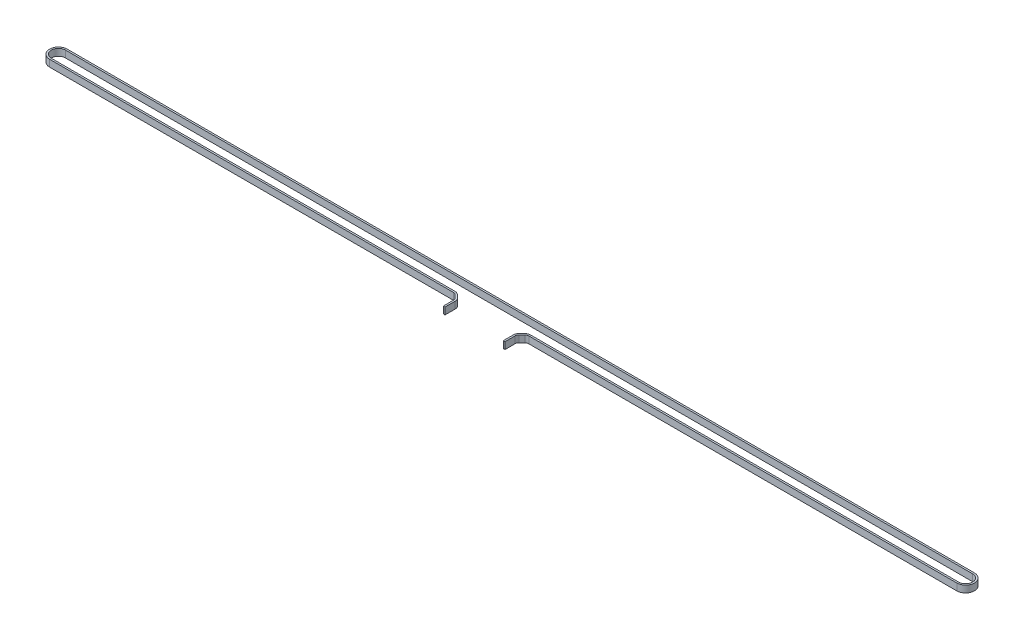
ISO-10303-21;
HEADER;
FILE_DESCRIPTION(('STEP AP214'),'2;1');
FILE_NAME('part.step','',(''),(''),'','','');
FILE_SCHEMA(('AUTOMOTIVE_DESIGN { 1 0 10303 214 1 1 1 1 }'));
ENDSEC;
DATA;
#1=APPLICATION_CONTEXT('core data for automotive mechanical design processes');
#2=APPLICATION_PROTOCOL_DEFINITION('international standard','automotive_design',2000,#1);
#3=PRODUCT_CONTEXT('',#1,'mechanical');
#4=PRODUCT('Part','Part','',(#3));
#5=PRODUCT_RELATED_PRODUCT_CATEGORY('part','',(#4));
#6=PRODUCT_DEFINITION_FORMATION('','',#4);
#7=PRODUCT_DEFINITION_CONTEXT('part definition',#1,'design');
#8=PRODUCT_DEFINITION('design','',#6,#7);
#9=PRODUCT_DEFINITION_SHAPE('','',#8);
#10=(LENGTH_UNIT() NAMED_UNIT(*) SI_UNIT(.MILLI.,.METRE.));
#11=(NAMED_UNIT(*) PLANE_ANGLE_UNIT() SI_UNIT($,.RADIAN.));
#12=(NAMED_UNIT(*) SI_UNIT($,.STERADIAN.) SOLID_ANGLE_UNIT());
#13=UNCERTAINTY_MEASURE_WITH_UNIT(LENGTH_MEASURE(1.E-05),#10,'distance_accuracy_value','');
#14=(GEOMETRIC_REPRESENTATION_CONTEXT(3) GLOBAL_UNCERTAINTY_ASSIGNED_CONTEXT((#13)) GLOBAL_UNIT_ASSIGNED_CONTEXT((#10,
#11,#12)) REPRESENTATION_CONTEXT('',''));
#15=CARTESIAN_POINT('',(0.,0.,0.));
#16=DIRECTION('',(0.,0.,1.));
#17=DIRECTION('',(1.,0.,0.));
#18=AXIS2_PLACEMENT_3D('',#15,#16,#17);
#19=CARTESIAN_POINT('',(397.,3.,6.19999999999985));
#20=DIRECTION('',(0.,0.,-1.));
#21=DIRECTION('',(-1.,0.,0.));
#22=AXIS2_PLACEMENT_3D('',#19,#20,#21);
#23=PLANE('',#22);
#24=DIRECTION('',(1.,0.,0.));
#25=VECTOR('',#24,1.);
#26=CARTESIAN_POINT('',(397.,3.,6.19999999999985));
#27=LINE('',#26,#25);
#28=CARTESIAN_POINT('',(-397.,3.,6.19999999999985));
#29=VERTEX_POINT('',#28);
#30=CARTESIAN_POINT('',(-43.6628270340245,3.,6.19999999999985));
#31=VERTEX_POINT('',#30);
#32=EDGE_CURVE('E293',#29,#31,#27,.T.);
#33=ORIENTED_EDGE('',*,*,#32,.T.);
#34=DIRECTION('',(0.,1.,0.));
#35=VECTOR('',#34,1.);
#36=CARTESIAN_POINT('',(-43.6628270340245,-3.,6.19999999999985));
#37=LINE('',#36,#35);
#38=CARTESIAN_POINT('',(-43.6628270340245,-3.,6.19999999999985));
#39=VERTEX_POINT('',#38);
#40=EDGE_CURVE('E381',#31,#39,#37,.F.);
#41=ORIENTED_EDGE('',*,*,#40,.T.);
#42=DIRECTION('',(1.,0.,0.));
#43=VECTOR('',#42,1.);
#44=CARTESIAN_POINT('',(397.,-3.,6.19999999999985));
#45=LINE('',#44,#43);
#46=CARTESIAN_POINT('',(-397.,-3.,6.19999999999985));
#47=VERTEX_POINT('',#46);
#48=EDGE_CURVE('E287',#47,#39,#45,.T.);
#49=ORIENTED_EDGE('',*,*,#48,.F.);
#50=DIRECTION('',(0.,-1.,0.));
#51=VECTOR('',#50,1.);
#52=CARTESIAN_POINT('',(-397.,3.,6.19999999999985));
#53=LINE('',#52,#51);
#54=EDGE_CURVE('E310',#29,#47,#53,.T.);
#55=ORIENTED_EDGE('',*,*,#54,.F.);
#56=EDGE_LOOP('',(#33,#41,#49,#55));
#57=FACE_BOUND('',#56,.T.);
#58=ADVANCED_FACE('F33',(#57),#23,.T.);
#59=CARTESIAN_POINT('',(397.,3.,7.69999999999985));
#60=DIRECTION('',(0.,0.,-1.));
#61=DIRECTION('',(-1.,0.,0.));
#62=AXIS2_PLACEMENT_3D('',#59,#60,#61);
#63=PLANE('',#62);
#64=DIRECTION('',(1.,0.,0.));
#65=VECTOR('',#64,1.);
#66=CARTESIAN_POINT('',(397.,3.,7.69999999999985));
#67=LINE('',#66,#65);
#68=CARTESIAN_POINT('',(22.3712533085623,3.,7.69999999999997));
#69=VERTEX_POINT('',#68);
#70=CARTESIAN_POINT('',(397.,3.,7.69999999999985));
#71=VERTEX_POINT('',#70);
#72=EDGE_CURVE('E326',#69,#71,#67,.T.);
#73=ORIENTED_EDGE('',*,*,#72,.F.);
#74=DIRECTION('',(0.,1.,0.));
#75=VECTOR('',#74,1.);
#76=CARTESIAN_POINT('',(22.3712533085623,-3.,7.69999999999997));
#77=LINE('',#76,#75);
#78=CARTESIAN_POINT('',(22.3712533085623,-3.,7.69999999999997));
#79=VERTEX_POINT('',#78);
#80=EDGE_CURVE('E389',#69,#79,#77,.F.);
#81=ORIENTED_EDGE('',*,*,#80,.T.);
#82=DIRECTION('',(1.,0.,0.));
#83=VECTOR('',#82,1.);
#84=CARTESIAN_POINT('',(397.,-3.,7.69999999999985));
#85=LINE('',#84,#83);
#86=CARTESIAN_POINT('',(397.,-3.,7.69999999999985));
#87=VERTEX_POINT('',#86);
#88=EDGE_CURVE('E336',#79,#87,#85,.T.);
#89=ORIENTED_EDGE('',*,*,#88,.T.);
#90=DIRECTION('',(0.,-1.,0.));
#91=VECTOR('',#90,1.);
#92=CARTESIAN_POINT('',(397.,3.,7.69999999999985));
#93=LINE('',#92,#91);
#94=EDGE_CURVE('E329',#71,#87,#93,.T.);
#95=ORIENTED_EDGE('',*,*,#94,.F.);
#96=EDGE_LOOP('',(#73,#81,#89,#95));
#97=FACE_BOUND('',#96,.T.);
#98=ADVANCED_FACE('F501',(#97),#63,.F.);
#99=CARTESIAN_POINT('',(-397.,-3.,7.7000000000001));
#100=VERTEX_POINT('',#99);
#101=CARTESIAN_POINT('',(-43.6628270340243,-3.,7.69999999999999));
#102=VERTEX_POINT('',#101);
#103=EDGE_CURVE('E322',#100,#102,#85,.T.);
#104=ORIENTED_EDGE('',*,*,#103,.T.);
#105=DIRECTION('',(0.,-1.,0.));
#106=VECTOR('',#105,1.);
#107=CARTESIAN_POINT('',(-43.6628270340243,3.,7.69999999999999));
#108=LINE('',#107,#106);
#109=CARTESIAN_POINT('',(-43.6628270340243,3.,7.69999999999999));
#110=VERTEX_POINT('',#109);
#111=EDGE_CURVE('E54',#102,#110,#108,.F.);
#112=ORIENTED_EDGE('',*,*,#111,.T.);
#113=CARTESIAN_POINT('',(-397.,3.,7.7000000000001));
#114=VERTEX_POINT('',#113);
#115=EDGE_CURVE('E327',#114,#110,#67,.T.);
#116=ORIENTED_EDGE('',*,*,#115,.F.);
#117=DIRECTION('',(0.,-1.,0.));
#118=VECTOR('',#117,1.);
#119=CARTESIAN_POINT('',(-397.,3.,7.7000000000001));
#120=LINE('',#119,#118);
#121=EDGE_CURVE('E340',#114,#100,#120,.T.);
#122=ORIENTED_EDGE('',*,*,#121,.T.);
#123=EDGE_LOOP('',(#104,#112,#116,#122));
#124=FACE_BOUND('',#123,.T.);
#125=ADVANCED_FACE('F435',(#124),#63,.F.);
#126=CARTESIAN_POINT('',(397.,3.,0.));
#127=DIRECTION('',(0.,1.,0.));
#128=DIRECTION('',(0.,0.,1.));
#129=AXIS2_PLACEMENT_3D('',#126,#127,#128);
#130=PLANE('',#129);
#131=CARTESIAN_POINT('',(22.3712533085624,3.,6.19999999999985));
#132=VERTEX_POINT('',#131);
#133=CARTESIAN_POINT('',(397.,3.,6.19999999999985));
#134=VERTEX_POINT('',#133);
#135=EDGE_CURVE('E292',#132,#134,#27,.T.);
#136=ORIENTED_EDGE('',*,*,#135,.F.);
#137=CARTESIAN_POINT('',(22.3712533085624,3.,11.1999999999999));
#138=DIRECTION('',(0.,1.,0.));
#139=DIRECTION('',(0.,0.,1.));
#140=AXIS2_PLACEMENT_3D('',#137,#138,#139);
#141=CIRCLE('',#140,5.);
#142=CARTESIAN_POINT('',(18.9017871033581,3.,7.59961054176829));
#143=VERTEX_POINT('',#142);
#144=EDGE_CURVE('E357',#132,#143,#141,.T.);
#145=ORIENTED_EDGE('',*,*,#144,.T.);
#146=DIRECTION('',(-0.720077891646316,0.,0.693893241040865));
#147=VECTOR('',#146,1.);
#148=CARTESIAN_POINT('',(14.854213137269,3.,11.4999999999989));
#149=LINE('',#148,#147);
#150=CARTESIAN_POINT('',(16.3847469320647,3.,10.0251219795597));
#151=VERTEX_POINT('',#150);
#152=EDGE_CURVE('E250',#143,#151,#149,.T.);
#153=ORIENTED_EDGE('',*,*,#152,.T.);
#154=CARTESIAN_POINT('',(19.854213137269,3.,13.6255114377912));
#155=DIRECTION('',(0.,1.,0.));
#156=DIRECTION('',(0.,0.,1.));
#157=AXIS2_PLACEMENT_3D('',#154,#155,#156);
#158=CIRCLE('',#157,5.);
#159=CARTESIAN_POINT('',(14.854213137269,3.,13.6255114377912));
#160=VERTEX_POINT('',#159);
#161=EDGE_CURVE('E226',#151,#160,#158,.T.);
#162=ORIENTED_EDGE('',*,*,#161,.T.);
#163=DIRECTION('',(0.,0.,1.));
#164=VECTOR('',#163,1.);
#165=CARTESIAN_POINT('',(14.854213137269,3.,22.4999999999989));
#166=LINE('',#165,#164);
#167=CARTESIAN_POINT('',(14.854213137269,3.,22.4999999999989));
#168=VERTEX_POINT('',#167);
#169=EDGE_CURVE('E217',#160,#168,#166,.T.);
#170=ORIENTED_EDGE('',*,*,#169,.T.);
#171=DIRECTION('',(1.,0.,0.));
#172=VECTOR('',#171,1.);
#173=CARTESIAN_POINT('',(16.354213137269,3.,22.4999999999989));
#174=LINE('',#173,#172);
#175=CARTESIAN_POINT('',(16.354213137269,3.,22.4999999999989));
#176=VERTEX_POINT('',#175);
#177=EDGE_CURVE('E222',#168,#176,#174,.T.);
#178=ORIENTED_EDGE('',*,*,#177,.T.);
#179=DIRECTION('',(0.,0.,-1.));
#180=VECTOR('',#179,1.);
#181=CARTESIAN_POINT('',(16.354213137269,3.,12.1376534313366));
#182=LINE('',#181,#180);
#183=CARTESIAN_POINT('',(16.354213137269,3.,13.6255114377912));
#184=VERTEX_POINT('',#183);
#185=EDGE_CURVE('E240',#176,#184,#182,.T.);
#186=ORIENTED_EDGE('',*,*,#185,.T.);
#187=CARTESIAN_POINT('',(19.854213137269,3.,13.6255114377912));
#188=DIRECTION('',(0.,1.,0.));
#189=DIRECTION('',(0.,0.,1.));
#190=AXIS2_PLACEMENT_3D('',#187,#188,#189);
#191=CIRCLE('',#190,3.5);
#192=CARTESIAN_POINT('',(17.4255867936259,3.,11.1052388170291));
#193=VERTEX_POINT('',#192);
#194=EDGE_CURVE('E408',#184,#193,#191,.F.);
#195=ORIENTED_EDGE('',*,*,#194,.T.);
#196=DIRECTION('',(0.720077891646316,0.,-0.693893241040865));
#197=VECTOR('',#196,1.);
#198=CARTESIAN_POINT('',(22.5159289622422,3.,6.19999999999985));
#199=LINE('',#198,#197);
#200=CARTESIAN_POINT('',(19.9426269649193,3.,8.67972737923786));
#201=VERTEX_POINT('',#200);
#202=EDGE_CURVE('E461',#193,#201,#199,.T.);
#203=ORIENTED_EDGE('',*,*,#202,.T.);
#204=CARTESIAN_POINT('',(22.3712533085623,3.,11.2));
#205=DIRECTION('',(0.,1.,0.));
#206=DIRECTION('',(0.,0.,1.));
#207=AXIS2_PLACEMENT_3D('',#204,#205,#206);
#208=CIRCLE('',#207,3.5);
#209=EDGE_CURVE('E402',#201,#69,#208,.F.);
#210=ORIENTED_EDGE('',*,*,#209,.T.);
#211=ORIENTED_EDGE('',*,*,#72,.T.);
#212=CARTESIAN_POINT('',(397.,3.,0.));
#213=DIRECTION('',(0.,1.,0.));
#214=DIRECTION('',(0.,0.,1.));
#215=AXIS2_PLACEMENT_3D('',#212,#213,#214);
#216=CIRCLE('',#215,7.7);
#217=CARTESIAN_POINT('',(397.,3.,-7.70000000000014));
#218=VERTEX_POINT('',#217);
#219=EDGE_CURVE('E318',#71,#218,#216,.T.);
#220=ORIENTED_EDGE('',*,*,#219,.T.);
#221=DIRECTION('',(-1.,0.,0.));
#222=VECTOR('',#221,1.);
#223=CARTESIAN_POINT('',(397.,3.,-7.70000000000014));
#224=LINE('',#223,#222);
#225=CARTESIAN_POINT('',(-397.,3.,-7.7));
#226=VERTEX_POINT('',#225);
#227=EDGE_CURVE('E321',#218,#226,#224,.T.);
#228=ORIENTED_EDGE('',*,*,#227,.T.);
#229=CARTESIAN_POINT('',(-397.,3.,0.));
#230=DIRECTION('',(0.,1.,0.));
#231=DIRECTION('',(0.,0.,1.));
#232=AXIS2_PLACEMENT_3D('',#229,#230,#231);
#233=CIRCLE('',#232,7.7);
#234=EDGE_CURVE('E324',#226,#114,#233,.T.);
#235=ORIENTED_EDGE('',*,*,#234,.T.);
#236=ORIENTED_EDGE('',*,*,#115,.T.);
#237=CARTESIAN_POINT('',(-43.6628270340243,3.,11.2));
#238=DIRECTION('',(0.,1.,0.));
#239=DIRECTION('',(0.,0.,1.));
#240=AXIS2_PLACEMENT_3D('',#237,#238,#239);
#241=CIRCLE('',#240,3.5);
#242=CARTESIAN_POINT('',(-41.2342006903813,3.,8.67972737923789));
#243=VERTEX_POINT('',#242);
#244=EDGE_CURVE('E11',#110,#243,#241,.F.);
#245=ORIENTED_EDGE('',*,*,#244,.T.);
#246=DIRECTION('',(0.720077891646313,0.,0.693893241040868));
#247=VECTOR('',#246,1.);
#248=CARTESIAN_POINT('',(-37.645786862731,3.,12.1376534313366));
#249=LINE('',#248,#247);
#250=CARTESIAN_POINT('',(-38.717160519088,3.,11.1052388170291));
#251=VERTEX_POINT('',#250);
#252=EDGE_CURVE('E257',#243,#251,#249,.T.);
#253=ORIENTED_EDGE('',*,*,#252,.T.);
#254=CARTESIAN_POINT('',(-41.145786862731,3.,13.6255114377912));
#255=DIRECTION('',(0.,1.,0.));
#256=DIRECTION('',(0.,0.,1.));
#257=AXIS2_PLACEMENT_3D('',#254,#255,#256);
#258=CIRCLE('',#257,3.5);
#259=CARTESIAN_POINT('',(-37.645786862731,3.,13.6255114377912));
#260=VERTEX_POINT('',#259);
#261=EDGE_CURVE('E412',#251,#260,#258,.F.);
#262=ORIENTED_EDGE('',*,*,#261,.T.);
#263=DIRECTION('',(0.,0.,1.));
#264=VECTOR('',#263,1.);
#265=CARTESIAN_POINT('',(-37.645786862731,3.,22.4999999999989));
#266=LINE('',#265,#264);
#267=CARTESIAN_POINT('',(-37.645786862731,3.,22.4999999999989));
#268=VERTEX_POINT('',#267);
#269=EDGE_CURVE('E261',#260,#268,#266,.T.);
#270=ORIENTED_EDGE('',*,*,#269,.T.);
#271=DIRECTION('',(1.,0.,0.));
#272=VECTOR('',#271,1.);
#273=CARTESIAN_POINT('',(-36.145786862731,3.,22.4999999999989));
#274=LINE('',#273,#272);
#275=CARTESIAN_POINT('',(-36.145786862731,3.,22.4999999999989));
#276=VERTEX_POINT('',#275);
#277=EDGE_CURVE('E263',#268,#276,#274,.T.);
#278=ORIENTED_EDGE('',*,*,#277,.T.);
#279=DIRECTION('',(0.,0.,-1.));
#280=VECTOR('',#279,1.);
#281=CARTESIAN_POINT('',(-36.145786862731,3.,14.4999999999989));
#282=LINE('',#281,#280);
#283=CARTESIAN_POINT('',(-36.145786862731,3.,13.6255114377912));
#284=VERTEX_POINT('',#283);
#285=EDGE_CURVE('E265',#276,#284,#282,.T.);
#286=ORIENTED_EDGE('',*,*,#285,.T.);
#287=CARTESIAN_POINT('',(-41.145786862731,3.,13.6255114377912));
#288=DIRECTION('',(0.,1.,0.));
#289=DIRECTION('',(0.,0.,1.));
#290=AXIS2_PLACEMENT_3D('',#287,#288,#289);
#291=CIRCLE('',#290,5.);
#292=CARTESIAN_POINT('',(-37.6763206575267,3.,10.0251219795597));
#293=VERTEX_POINT('',#292);
#294=EDGE_CURVE('E354',#284,#293,#291,.T.);
#295=ORIENTED_EDGE('',*,*,#294,.T.);
#296=DIRECTION('',(-0.720077891646314,0.,-0.693893241040867));
#297=VECTOR('',#296,1.);
#298=CARTESIAN_POINT('',(-36.145786862731,3.,11.4999999999989));
#299=LINE('',#298,#297);
#300=CARTESIAN_POINT('',(-40.1933608288201,3.,7.59961054176828));
#301=VERTEX_POINT('',#300);
#302=EDGE_CURVE('E254',#293,#301,#299,.T.);
#303=ORIENTED_EDGE('',*,*,#302,.T.);
#304=CARTESIAN_POINT('',(-43.6628270340245,3.,11.1999999999999));
#305=DIRECTION('',(0.,1.,0.));
#306=DIRECTION('',(0.,0.,1.));
#307=AXIS2_PLACEMENT_3D('',#304,#305,#306);
#308=CIRCLE('',#307,5.);
#309=EDGE_CURVE('E352',#301,#31,#308,.T.);
#310=ORIENTED_EDGE('',*,*,#309,.T.);
#311=ORIENTED_EDGE('',*,*,#32,.F.);
#312=CARTESIAN_POINT('',(-397.,3.,0.));
#313=DIRECTION('',(0.,1.,0.));
#314=DIRECTION('',(0.,0.,1.));
#315=AXIS2_PLACEMENT_3D('',#312,#313,#314);
#316=CIRCLE('',#315,6.19999999999993);
#317=CARTESIAN_POINT('',(-397.,3.,-6.19999999999993));
#318=VERTEX_POINT('',#317);
#319=EDGE_CURVE('E289',#318,#29,#316,.T.);
#320=ORIENTED_EDGE('',*,*,#319,.F.);
#321=DIRECTION('',(-1.,0.,0.));
#322=VECTOR('',#321,1.);
#323=CARTESIAN_POINT('',(397.,3.,-6.20000000000014));
#324=LINE('',#323,#322);
#325=CARTESIAN_POINT('',(397.,3.,-6.20000000000014));
#326=VERTEX_POINT('',#325);
#327=EDGE_CURVE('E286',#326,#318,#324,.T.);
#328=ORIENTED_EDGE('',*,*,#327,.F.);
#329=CARTESIAN_POINT('',(397.,3.,0.));
#330=DIRECTION('',(0.,1.,0.));
#331=DIRECTION('',(0.,0.,1.));
#332=AXIS2_PLACEMENT_3D('',#329,#330,#331);
#333=CIRCLE('',#332,6.2);
#334=EDGE_CURVE('E284',#134,#326,#333,.T.);
#335=ORIENTED_EDGE('',*,*,#334,.F.);
#336=EDGE_LOOP('',(#136,#145,#153,#162,#170,#178,#186,#195,#203,#210,#211,#220,#228,#235,#236,
#245,#253,#262,#270,#278,#286,#295,#303,#310,#311,#320,#328,#335));
#337=FACE_BOUND('',#336,.T.);
#338=ADVANCED_FACE('F220',(#337),#130,.T.);
#339=CARTESIAN_POINT('',(397.,-3.,0.));
#340=DIRECTION('',(0.,1.,0.));
#341=DIRECTION('',(0.,0.,1.));
#342=AXIS2_PLACEMENT_3D('',#339,#340,#341);
#343=PLANE('',#342);
#344=DIRECTION('',(-0.720077891646316,0.,0.693893241040865));
#345=VECTOR('',#344,1.);
#346=CARTESIAN_POINT('',(14.854213137269,-3.,11.4999999999989));
#347=LINE('',#346,#345);
#348=CARTESIAN_POINT('',(18.9017871033581,-3.,7.59961054176829));
#349=VERTEX_POINT('',#348);
#350=CARTESIAN_POINT('',(16.3847469320647,-3.,10.0251219795597));
#351=VERTEX_POINT('',#350);
#352=EDGE_CURVE('E476',#349,#351,#347,.T.);
#353=ORIENTED_EDGE('',*,*,#352,.F.);
#354=CARTESIAN_POINT('',(22.3712533085624,-3.,11.1999999999999));
#355=DIRECTION('',(0.,1.,0.));
#356=DIRECTION('',(0.,0.,1.));
#357=AXIS2_PLACEMENT_3D('',#354,#355,#356);
#358=CIRCLE('',#357,5.);
#359=CARTESIAN_POINT('',(22.3712533085624,-3.,6.19999999999985));
#360=VERTEX_POINT('',#359);
#361=EDGE_CURVE('E369',#349,#360,#358,.F.);
#362=ORIENTED_EDGE('',*,*,#361,.T.);
#363=CARTESIAN_POINT('',(397.,-3.,6.19999999999985));
#364=VERTEX_POINT('',#363);
#365=EDGE_CURVE('E305',#360,#364,#45,.T.);
#366=ORIENTED_EDGE('',*,*,#365,.T.);
#367=CARTESIAN_POINT('',(397.,-3.,0.));
#368=DIRECTION('',(0.,1.,0.));
#369=DIRECTION('',(0.,0.,1.));
#370=AXIS2_PLACEMENT_3D('',#367,#368,#369);
#371=CIRCLE('',#370,6.2);
#372=CARTESIAN_POINT('',(397.,-3.,-6.20000000000014));
#373=VERTEX_POINT('',#372);
#374=EDGE_CURVE('E283',#364,#373,#371,.T.);
#375=ORIENTED_EDGE('',*,*,#374,.T.);
#376=DIRECTION('',(-1.,0.,0.));
#377=VECTOR('',#376,1.);
#378=CARTESIAN_POINT('',(397.,-3.,-6.20000000000014));
#379=LINE('',#378,#377);
#380=CARTESIAN_POINT('',(-397.,-3.,-6.19999999999993));
#381=VERTEX_POINT('',#380);
#382=EDGE_CURVE('E299',#373,#381,#379,.T.);
#383=ORIENTED_EDGE('',*,*,#382,.T.);
#384=CARTESIAN_POINT('',(-397.,-3.,0.));
#385=DIRECTION('',(0.,1.,0.));
#386=DIRECTION('',(0.,0.,1.));
#387=AXIS2_PLACEMENT_3D('',#384,#385,#386);
#388=CIRCLE('',#387,6.19999999999993);
#389=EDGE_CURVE('E302',#381,#47,#388,.T.);
#390=ORIENTED_EDGE('',*,*,#389,.T.);
#391=ORIENTED_EDGE('',*,*,#48,.T.);
#392=CARTESIAN_POINT('',(-43.6628270340245,-3.,11.1999999999999));
#393=DIRECTION('',(0.,1.,0.));
#394=DIRECTION('',(0.,0.,1.));
#395=AXIS2_PLACEMENT_3D('',#392,#393,#394);
#396=CIRCLE('',#395,5.);
#397=CARTESIAN_POINT('',(-40.1933608288201,-3.,7.59961054176828));
#398=VERTEX_POINT('',#397);
#399=EDGE_CURVE('E363',#39,#398,#396,.F.);
#400=ORIENTED_EDGE('',*,*,#399,.T.);
#401=DIRECTION('',(-0.720077891646314,0.,-0.693893241040867));
#402=VECTOR('',#401,1.);
#403=CARTESIAN_POINT('',(-36.145786862731,-3.,11.4999999999989));
#404=LINE('',#403,#402);
#405=CARTESIAN_POINT('',(-37.6763206575267,-3.,10.0251219795597));
#406=VERTEX_POINT('',#405);
#407=EDGE_CURVE('E245',#406,#398,#404,.T.);
#408=ORIENTED_EDGE('',*,*,#407,.F.);
#409=CARTESIAN_POINT('',(-41.145786862731,-3.,13.6255114377912));
#410=DIRECTION('',(0.,1.,0.));
#411=DIRECTION('',(0.,0.,1.));
#412=AXIS2_PLACEMENT_3D('',#409,#410,#411);
#413=CIRCLE('',#412,5.);
#414=CARTESIAN_POINT('',(-36.145786862731,-3.,13.6255114377912));
#415=VERTEX_POINT('',#414);
#416=EDGE_CURVE('E365',#406,#415,#413,.F.);
#417=ORIENTED_EDGE('',*,*,#416,.T.);
#418=DIRECTION('',(0.,0.,-1.));
#419=VECTOR('',#418,1.);
#420=CARTESIAN_POINT('',(-36.145786862731,-3.,11.4999999999989));
#421=LINE('',#420,#419);
#422=CARTESIAN_POINT('',(-36.145786862731,-3.,22.4999999999989));
#423=VERTEX_POINT('',#422);
#424=EDGE_CURVE('E258',#423,#415,#421,.T.);
#425=ORIENTED_EDGE('',*,*,#424,.F.);
#426=DIRECTION('',(1.,0.,0.));
#427=VECTOR('',#426,1.);
#428=CARTESIAN_POINT('',(-36.145786862731,-3.,22.4999999999989));
#429=LINE('',#428,#427);
#430=CARTESIAN_POINT('',(-37.645786862731,-3.,22.4999999999989));
#431=VERTEX_POINT('',#430);
#432=EDGE_CURVE('E273',#431,#423,#429,.T.);
#433=ORIENTED_EDGE('',*,*,#432,.F.);
#434=DIRECTION('',(0.,0.,1.));
#435=VECTOR('',#434,1.);
#436=CARTESIAN_POINT('',(-37.645786862731,-3.,22.4999999999989));
#437=LINE('',#436,#435);
#438=CARTESIAN_POINT('',(-37.645786862731,-3.,13.6255114377912));
#439=VERTEX_POINT('',#438);
#440=EDGE_CURVE('E271',#439,#431,#437,.T.);
#441=ORIENTED_EDGE('',*,*,#440,.F.);
#442=CARTESIAN_POINT('',(-41.145786862731,-3.,13.6255114377912));
#443=DIRECTION('',(0.,1.,0.));
#444=DIRECTION('',(0.,0.,1.));
#445=AXIS2_PLACEMENT_3D('',#442,#443,#444);
#446=CIRCLE('',#445,3.5);
#447=CARTESIAN_POINT('',(-38.717160519088,-3.,11.1052388170291));
#448=VERTEX_POINT('',#447);
#449=EDGE_CURVE('E410',#439,#448,#446,.T.);
#450=ORIENTED_EDGE('',*,*,#449,.T.);
#451=DIRECTION('',(0.720077891646313,0.,0.693893241040868));
#452=VECTOR('',#451,1.);
#453=CARTESIAN_POINT('',(-37.645786862731,-3.,12.1376534313366));
#454=LINE('',#453,#452);
#455=CARTESIAN_POINT('',(-41.2342006903813,-3.,8.67972737923789));
#456=VERTEX_POINT('',#455);
#457=EDGE_CURVE('E248',#456,#448,#454,.T.);
#458=ORIENTED_EDGE('',*,*,#457,.F.);
#459=CARTESIAN_POINT('',(-43.6628270340243,-3.,11.2));
#460=DIRECTION('',(0.,1.,0.));
#461=DIRECTION('',(0.,0.,1.));
#462=AXIS2_PLACEMENT_3D('',#459,#460,#461);
#463=CIRCLE('',#462,3.5);
#464=EDGE_CURVE('E41',#456,#102,#463,.T.);
#465=ORIENTED_EDGE('',*,*,#464,.T.);
#466=ORIENTED_EDGE('',*,*,#103,.F.);
#467=CARTESIAN_POINT('',(-397.,-3.,0.));
#468=DIRECTION('',(0.,1.,0.));
#469=DIRECTION('',(0.,0.,1.));
#470=AXIS2_PLACEMENT_3D('',#467,#468,#469);
#471=CIRCLE('',#470,7.7);
#472=CARTESIAN_POINT('',(-397.,-3.,-7.7));
#473=VERTEX_POINT('',#472);
#474=EDGE_CURVE('E334',#473,#100,#471,.T.);
#475=ORIENTED_EDGE('',*,*,#474,.F.);
#476=DIRECTION('',(-1.,0.,0.));
#477=VECTOR('',#476,1.);
#478=CARTESIAN_POINT('',(397.,-3.,-7.70000000000014));
#479=LINE('',#478,#477);
#480=CARTESIAN_POINT('',(397.,-3.,-7.70000000000014));
#481=VERTEX_POINT('',#480);
#482=EDGE_CURVE('E332',#481,#473,#479,.T.);
#483=ORIENTED_EDGE('',*,*,#482,.F.);
#484=CARTESIAN_POINT('',(397.,-3.,0.));
#485=DIRECTION('',(0.,1.,0.));
#486=DIRECTION('',(0.,0.,1.));
#487=AXIS2_PLACEMENT_3D('',#484,#485,#486);
#488=CIRCLE('',#487,7.7);
#489=EDGE_CURVE('E317',#87,#481,#488,.T.);
#490=ORIENTED_EDGE('',*,*,#489,.F.);
#491=ORIENTED_EDGE('',*,*,#88,.F.);
#492=CARTESIAN_POINT('',(22.3712533085623,-3.,11.2));
#493=DIRECTION('',(0.,1.,0.));
#494=DIRECTION('',(0.,0.,1.));
#495=AXIS2_PLACEMENT_3D('',#492,#493,#494);
#496=CIRCLE('',#495,3.5);
#497=CARTESIAN_POINT('',(19.9426269649193,-3.,8.67972737923786));
#498=VERTEX_POINT('',#497);
#499=EDGE_CURVE('E404',#79,#498,#496,.T.);
#500=ORIENTED_EDGE('',*,*,#499,.T.);
#501=DIRECTION('',(0.720077891646316,0.,-0.693893241040865));
#502=VECTOR('',#501,1.);
#503=CARTESIAN_POINT('',(22.5159289622422,-3.,6.19999999999985));
#504=LINE('',#503,#502);
#505=CARTESIAN_POINT('',(17.4255867936259,-3.,11.1052388170291));
#506=VERTEX_POINT('',#505);
#507=EDGE_CURVE('E463',#506,#498,#504,.T.);
#508=ORIENTED_EDGE('',*,*,#507,.F.);
#509=CARTESIAN_POINT('',(19.854213137269,-3.,13.6255114377912));
#510=DIRECTION('',(0.,1.,0.));
#511=DIRECTION('',(0.,0.,1.));
#512=AXIS2_PLACEMENT_3D('',#509,#510,#511);
#513=CIRCLE('',#512,3.5);
#514=CARTESIAN_POINT('',(16.354213137269,-3.,13.6255114377912));
#515=VERTEX_POINT('',#514);
#516=EDGE_CURVE('E406',#506,#515,#513,.T.);
#517=ORIENTED_EDGE('',*,*,#516,.T.);
#518=DIRECTION('',(0.,0.,-1.));
#519=VECTOR('',#518,1.);
#520=CARTESIAN_POINT('',(16.354213137269,-3.,12.1376534313366));
#521=LINE('',#520,#519);
#522=CARTESIAN_POINT('',(16.354213137269,-3.,22.4999999999989));
#523=VERTEX_POINT('',#522);
#524=EDGE_CURVE('E472',#523,#515,#521,.T.);
#525=ORIENTED_EDGE('',*,*,#524,.F.);
#526=DIRECTION('',(1.,0.,0.));
#527=VECTOR('',#526,1.);
#528=CARTESIAN_POINT('',(16.354213137269,-3.,22.4999999999989));
#529=LINE('',#528,#527);
#530=CARTESIAN_POINT('',(14.854213137269,-3.,22.4999999999989));
#531=VERTEX_POINT('',#530);
#532=EDGE_CURVE('E470',#531,#523,#529,.T.);
#533=ORIENTED_EDGE('',*,*,#532,.F.);
#534=DIRECTION('',(0.,0.,1.));
#535=VECTOR('',#534,1.);
#536=CARTESIAN_POINT('',(14.854213137269,-3.,14.4999999999989));
#537=LINE('',#536,#535);
#538=CARTESIAN_POINT('',(14.854213137269,-3.,13.6255114377912));
#539=VERTEX_POINT('',#538);
#540=EDGE_CURVE('E231',#539,#531,#537,.T.);
#541=ORIENTED_EDGE('',*,*,#540,.F.);
#542=CARTESIAN_POINT('',(19.854213137269,-3.,13.6255114377912));
#543=DIRECTION('',(0.,1.,0.));
#544=DIRECTION('',(0.,0.,1.));
#545=AXIS2_PLACEMENT_3D('',#542,#543,#544);
#546=CIRCLE('',#545,5.);
#547=EDGE_CURVE('E367',#539,#351,#546,.F.);
#548=ORIENTED_EDGE('',*,*,#547,.T.);
#549=EDGE_LOOP('',(#353,#362,#366,#375,#383,#390,#391,#400,#408,#417,#425,#433,#441,#450,#458,
#465,#466,#475,#483,#490,#491,#500,#508,#517,#525,#533,#541,#548));
#550=FACE_BOUND('',#549,.T.);
#551=ADVANCED_FACE('F426',(#550),#343,.F.);
#552=CARTESIAN_POINT('',(397.,3.,0.));
#553=DIRECTION('',(0.,-1.,0.));
#554=DIRECTION('',(0.,0.,-1.));
#555=AXIS2_PLACEMENT_3D('',#552,#553,#554);
#556=CYLINDRICAL_SURFACE('',#555,7.7);
#557=ORIENTED_EDGE('',*,*,#489,.T.);
#558=DIRECTION('',(0.,-1.,0.));
#559=VECTOR('',#558,1.);
#560=CARTESIAN_POINT('',(397.,3.,-7.70000000000014));
#561=LINE('',#560,#559);
#562=EDGE_CURVE('E346',#218,#481,#561,.T.);
#563=ORIENTED_EDGE('',*,*,#562,.F.);
#564=ORIENTED_EDGE('',*,*,#219,.F.);
#565=ORIENTED_EDGE('',*,*,#94,.T.);
#566=EDGE_LOOP('',(#557,#563,#564,#565));
#567=FACE_BOUND('',#566,.T.);
#568=ADVANCED_FACE('F446',(#567),#556,.T.);
#569=CARTESIAN_POINT('',(397.,3.,-7.70000000000014));
#570=DIRECTION('',(0.,0.,1.));
#571=DIRECTION('',(1.,0.,0.));
#572=AXIS2_PLACEMENT_3D('',#569,#570,#571);
#573=PLANE('',#572);
#574=ORIENTED_EDGE('',*,*,#482,.T.);
#575=DIRECTION('',(0.,-1.,0.));
#576=VECTOR('',#575,1.);
#577=CARTESIAN_POINT('',(-397.,3.,-7.7));
#578=LINE('',#577,#576);
#579=EDGE_CURVE('E343',#226,#473,#578,.T.);
#580=ORIENTED_EDGE('',*,*,#579,.F.);
#581=ORIENTED_EDGE('',*,*,#227,.F.);
#582=ORIENTED_EDGE('',*,*,#562,.T.);
#583=EDGE_LOOP('',(#574,#580,#581,#582));
#584=FACE_BOUND('',#583,.T.);
#585=ADVANCED_FACE('F442',(#584),#573,.F.);
#586=CARTESIAN_POINT('',(-397.,3.,0.));
#587=DIRECTION('',(0.,-1.,0.));
#588=DIRECTION('',(0.,0.,-1.));
#589=AXIS2_PLACEMENT_3D('',#586,#587,#588);
#590=CYLINDRICAL_SURFACE('',#589,7.7);
#591=ORIENTED_EDGE('',*,*,#474,.T.);
#592=ORIENTED_EDGE('',*,*,#121,.F.);
#593=ORIENTED_EDGE('',*,*,#234,.F.);
#594=ORIENTED_EDGE('',*,*,#579,.T.);
#595=EDGE_LOOP('',(#591,#592,#593,#594));
#596=FACE_BOUND('',#595,.T.);
#597=ADVANCED_FACE('F439',(#596),#590,.T.);
#598=CARTESIAN_POINT('',(397.,3.,0.));
#599=DIRECTION('',(0.,-1.,0.));
#600=DIRECTION('',(0.,0.,-1.));
#601=AXIS2_PLACEMENT_3D('',#598,#599,#600);
#602=CYLINDRICAL_SURFACE('',#601,6.2);
#603=ORIENTED_EDGE('',*,*,#374,.F.);
#604=DIRECTION('',(0.,-1.,0.));
#605=VECTOR('',#604,1.);
#606=CARTESIAN_POINT('',(397.,3.,6.19999999999985));
#607=LINE('',#606,#605);
#608=EDGE_CURVE('E296',#134,#364,#607,.T.);
#609=ORIENTED_EDGE('',*,*,#608,.F.);
#610=ORIENTED_EDGE('',*,*,#334,.T.);
#611=DIRECTION('',(0.,-1.,0.));
#612=VECTOR('',#611,1.);
#613=CARTESIAN_POINT('',(397.,3.,-6.20000000000014));
#614=LINE('',#613,#612);
#615=EDGE_CURVE('E314',#326,#373,#614,.T.);
#616=ORIENTED_EDGE('',*,*,#615,.T.);
#617=EDGE_LOOP('',(#603,#609,#610,#616));
#618=FACE_BOUND('',#617,.T.);
#619=ADVANCED_FACE('F533',(#618),#602,.F.);
#620=CARTESIAN_POINT('',(397.,3.,-6.20000000000014));
#621=DIRECTION('',(0.,0.,1.));
#622=DIRECTION('',(1.,0.,0.));
#623=AXIS2_PLACEMENT_3D('',#620,#621,#622);
#624=PLANE('',#623);
#625=ORIENTED_EDGE('',*,*,#382,.F.);
#626=ORIENTED_EDGE('',*,*,#615,.F.);
#627=ORIENTED_EDGE('',*,*,#327,.T.);
#628=DIRECTION('',(0.,-1.,0.));
#629=VECTOR('',#628,1.);
#630=CARTESIAN_POINT('',(-397.,3.,-6.19999999999993));
#631=LINE('',#630,#629);
#632=EDGE_CURVE('E312',#318,#381,#631,.T.);
#633=ORIENTED_EDGE('',*,*,#632,.T.);
#634=EDGE_LOOP('',(#625,#626,#627,#633));
#635=FACE_BOUND('',#634,.T.);
#636=ADVANCED_FACE('F522',(#635),#624,.T.);
#637=CARTESIAN_POINT('',(-397.,3.,0.));
#638=DIRECTION('',(0.,-1.,0.));
#639=DIRECTION('',(0.,0.,-1.));
#640=AXIS2_PLACEMENT_3D('',#637,#638,#639);
#641=CYLINDRICAL_SURFACE('',#640,6.19999999999993);
#642=ORIENTED_EDGE('',*,*,#389,.F.);
#643=ORIENTED_EDGE('',*,*,#632,.F.);
#644=ORIENTED_EDGE('',*,*,#319,.T.);
#645=ORIENTED_EDGE('',*,*,#54,.T.);
#646=EDGE_LOOP('',(#642,#643,#644,#645));
#647=FACE_BOUND('',#646,.T.);
#648=ADVANCED_FACE('F514',(#647),#641,.F.);
#649=ORIENTED_EDGE('',*,*,#365,.F.);
#650=DIRECTION('',(0.,1.,0.));
#651=VECTOR('',#650,1.);
#652=CARTESIAN_POINT('',(22.3712533085624,3.,6.19999999999985));
#653=LINE('',#652,#651);
#654=EDGE_CURVE('E349',#360,#132,#653,.T.);
#655=ORIENTED_EDGE('',*,*,#654,.T.);
#656=ORIENTED_EDGE('',*,*,#135,.T.);
#657=ORIENTED_EDGE('',*,*,#608,.T.);
#658=EDGE_LOOP('',(#649,#655,#656,#657));
#659=FACE_BOUND('',#658,.T.);
#660=ADVANCED_FACE('F504',(#659),#23,.T.);
#661=CARTESIAN_POINT('',(-36.145786862731,3.,11.4999999999989));
#662=DIRECTION('',(-0.693893241040867,0.,0.720077891646315));
#663=DIRECTION('',(0.720077891646315,0.,0.693893241040867));
#664=AXIS2_PLACEMENT_3D('',#661,#662,#663);
#665=PLANE('',#664);
#666=ORIENTED_EDGE('',*,*,#302,.F.);
#667=DIRECTION('',(0.,-1.,0.));
#668=VECTOR('',#667,1.);
#669=CARTESIAN_POINT('',(-37.6763206575267,3.,10.0251219795597));
#670=LINE('',#669,#668);
#671=EDGE_CURVE('E376',#293,#406,#670,.T.);
#672=ORIENTED_EDGE('',*,*,#671,.T.);
#673=ORIENTED_EDGE('',*,*,#407,.T.);
#674=DIRECTION('',(0.,1.,0.));
#675=VECTOR('',#674,1.);
#676=CARTESIAN_POINT('',(-40.1933608288201,3.,7.59961054176828));
#677=LINE('',#676,#675);
#678=EDGE_CURVE('E373',#398,#301,#677,.T.);
#679=ORIENTED_EDGE('',*,*,#678,.T.);
#680=EDGE_LOOP('',(#666,#672,#673,#679));
#681=FACE_BOUND('',#680,.T.);
#682=ADVANCED_FACE('F513',(#681),#665,.F.);
#683=CARTESIAN_POINT('',(-37.645786862731,3.,12.1376534313366));
#684=DIRECTION('',(0.693893241040868,0.,-0.720077891646313));
#685=DIRECTION('',(-0.720077891646313,0.,-0.693893241040868));
#686=AXIS2_PLACEMENT_3D('',#683,#684,#685);
#687=PLANE('',#686);
#688=ORIENTED_EDGE('',*,*,#457,.T.);
#689=DIRECTION('',(0.,-1.,0.));
#690=VECTOR('',#689,1.);
#691=CARTESIAN_POINT('',(-38.717160519088,3.,11.1052388170291));
#692=LINE('',#691,#690);
#693=EDGE_CURVE('E399',#448,#251,#692,.F.);
#694=ORIENTED_EDGE('',*,*,#693,.T.);
#695=ORIENTED_EDGE('',*,*,#252,.F.);
#696=DIRECTION('',(0.,-1.,0.));
#697=VECTOR('',#696,1.);
#698=CARTESIAN_POINT('',(-41.2342006903813,-3.,8.67972737923789));
#699=LINE('',#698,#697);
#700=EDGE_CURVE('E396',#243,#456,#699,.T.);
#701=ORIENTED_EDGE('',*,*,#700,.T.);
#702=EDGE_LOOP('',(#688,#694,#695,#701));
#703=FACE_BOUND('',#702,.T.);
#704=ADVANCED_FACE('F429',(#703),#687,.F.);
#705=CARTESIAN_POINT('',(-37.645786862731,3.,22.4999999999989));
#706=DIRECTION('',(1.,0.,0.));
#707=DIRECTION('',(0.,0.,-1.));
#708=AXIS2_PLACEMENT_3D('',#705,#706,#707);
#709=PLANE('',#708);
#710=ORIENTED_EDGE('',*,*,#269,.F.);
#711=DIRECTION('',(0.,-1.,0.));
#712=VECTOR('',#711,1.);
#713=CARTESIAN_POINT('',(-37.645786862731,-3.,13.6255114377912));
#714=LINE('',#713,#712);
#715=EDGE_CURVE('E393',#260,#439,#714,.T.);
#716=ORIENTED_EDGE('',*,*,#715,.T.);
#717=ORIENTED_EDGE('',*,*,#440,.T.);
#718=DIRECTION('',(0.,-1.,0.));
#719=VECTOR('',#718,1.);
#720=CARTESIAN_POINT('',(-37.645786862731,3.,22.4999999999989));
#721=LINE('',#720,#719);
#722=EDGE_CURVE('E280',#268,#431,#721,.T.);
#723=ORIENTED_EDGE('',*,*,#722,.F.);
#724=EDGE_LOOP('',(#710,#716,#717,#723));
#725=FACE_BOUND('',#724,.T.);
#726=ADVANCED_FACE('F421',(#725),#709,.F.);
#727=CARTESIAN_POINT('',(-36.145786862731,3.,22.4999999999989));
#728=DIRECTION('',(0.,0.,-1.));
#729=DIRECTION('',(-1.,0.,0.));
#730=AXIS2_PLACEMENT_3D('',#727,#728,#729);
#731=PLANE('',#730);
#732=ORIENTED_EDGE('',*,*,#432,.T.);
#733=DIRECTION('',(0.,-1.,0.));
#734=VECTOR('',#733,1.);
#735=CARTESIAN_POINT('',(-36.145786862731,3.,22.4999999999989));
#736=LINE('',#735,#734);
#737=EDGE_CURVE('E267',#276,#423,#736,.T.);
#738=ORIENTED_EDGE('',*,*,#737,.F.);
#739=ORIENTED_EDGE('',*,*,#277,.F.);
#740=ORIENTED_EDGE('',*,*,#722,.T.);
#741=EDGE_LOOP('',(#732,#738,#739,#740));
#742=FACE_BOUND('',#741,.T.);
#743=ADVANCED_FACE('F557',(#742),#731,.F.);
#744=CARTESIAN_POINT('',(-36.145786862731,3.,11.4999999999989));
#745=DIRECTION('',(-1.,0.,0.));
#746=DIRECTION('',(0.,0.,1.));
#747=AXIS2_PLACEMENT_3D('',#744,#745,#746);
#748=PLANE('',#747);
#749=ORIENTED_EDGE('',*,*,#424,.T.);
#750=DIRECTION('',(0.,-1.,0.));
#751=VECTOR('',#750,1.);
#752=CARTESIAN_POINT('',(-36.145786862731,3.,13.6255114377912));
#753=LINE('',#752,#751);
#754=EDGE_CURVE('E379',#415,#284,#753,.F.);
#755=ORIENTED_EDGE('',*,*,#754,.T.);
#756=ORIENTED_EDGE('',*,*,#285,.F.);
#757=ORIENTED_EDGE('',*,*,#737,.T.);
#758=EDGE_LOOP('',(#749,#755,#756,#757));
#759=FACE_BOUND('',#758,.T.);
#760=ADVANCED_FACE('F554',(#759),#748,.F.);
#761=CARTESIAN_POINT('',(22.5159289622422,3.,6.19999999999985));
#762=DIRECTION('',(-0.693893241040865,0.,-0.720077891646316));
#763=DIRECTION('',(-0.720077891646316,0.,0.693893241040865));
#764=AXIS2_PLACEMENT_3D('',#761,#762,#763);
#765=PLANE('',#764);
#766=ORIENTED_EDGE('',*,*,#507,.T.);
#767=DIRECTION('',(0.,1.,0.));
#768=VECTOR('',#767,1.);
#769=CARTESIAN_POINT('',(19.9426269649193,3.,8.67972737923786));
#770=LINE('',#769,#768);
#771=EDGE_CURVE('E386',#498,#201,#770,.T.);
#772=ORIENTED_EDGE('',*,*,#771,.T.);
#773=ORIENTED_EDGE('',*,*,#202,.F.);
#774=DIRECTION('',(0.,-1.,0.));
#775=VECTOR('',#774,1.);
#776=CARTESIAN_POINT('',(17.425586793626,-3.,11.1052388170291));
#777=LINE('',#776,#775);
#778=EDGE_CURVE('E383',#193,#506,#777,.T.);
#779=ORIENTED_EDGE('',*,*,#778,.T.);
#780=EDGE_LOOP('',(#766,#772,#773,#779));
#781=FACE_BOUND('',#780,.T.);
#782=ADVANCED_FACE('F460',(#781),#765,.F.);
#783=CARTESIAN_POINT('',(14.854213137269,3.,11.4999999999989));
#784=DIRECTION('',(0.693893241040865,0.,0.720077891646316));
#785=DIRECTION('',(0.720077891646316,0.,-0.693893241040865));
#786=AXIS2_PLACEMENT_3D('',#783,#784,#785);
#787=PLANE('',#786);
#788=ORIENTED_EDGE('',*,*,#152,.F.);
#789=DIRECTION('',(0.,1.,0.));
#790=VECTOR('',#789,1.);
#791=CARTESIAN_POINT('',(18.9017871033581,-3.,7.59961054176829));
#792=LINE('',#791,#790);
#793=EDGE_CURVE('E361',#143,#349,#792,.F.);
#794=ORIENTED_EDGE('',*,*,#793,.T.);
#795=ORIENTED_EDGE('',*,*,#352,.T.);
#796=DIRECTION('',(0.,-1.,0.));
#797=VECTOR('',#796,1.);
#798=CARTESIAN_POINT('',(16.3847469320647,3.,10.0251219795597));
#799=LINE('',#798,#797);
#800=EDGE_CURVE('E359',#351,#151,#799,.F.);
#801=ORIENTED_EDGE('',*,*,#800,.T.);
#802=EDGE_LOOP('',(#788,#794,#795,#801));
#803=FACE_BOUND('',#802,.T.);
#804=ADVANCED_FACE('F481',(#803),#787,.F.);
#805=CARTESIAN_POINT('',(16.354213137269,3.,22.4999999999989));
#806=DIRECTION('',(0.,0.,-1.));
#807=DIRECTION('',(-1.,0.,0.));
#808=AXIS2_PLACEMENT_3D('',#805,#806,#807);
#809=PLANE('',#808);
#810=ORIENTED_EDGE('',*,*,#532,.T.);
#811=DIRECTION('',(0.,-1.,0.));
#812=VECTOR('',#811,1.);
#813=CARTESIAN_POINT('',(16.354213137269,3.,22.4999999999989));
#814=LINE('',#813,#812);
#815=EDGE_CURVE('E238',#176,#523,#814,.T.);
#816=ORIENTED_EDGE('',*,*,#815,.F.);
#817=ORIENTED_EDGE('',*,*,#177,.F.);
#818=DIRECTION('',(0.,-1.,0.));
#819=VECTOR('',#818,1.);
#820=CARTESIAN_POINT('',(14.854213137269,3.,22.4999999999989));
#821=LINE('',#820,#819);
#822=EDGE_CURVE('E236',#168,#531,#821,.T.);
#823=ORIENTED_EDGE('',*,*,#822,.T.);
#824=EDGE_LOOP('',(#810,#816,#817,#823));
#825=FACE_BOUND('',#824,.T.);
#826=ADVANCED_FACE('F235',(#825),#809,.F.);
#827=CARTESIAN_POINT('',(16.354213137269,3.,12.1376534313366));
#828=DIRECTION('',(-1.,0.,0.));
#829=DIRECTION('',(0.,0.,1.));
#830=AXIS2_PLACEMENT_3D('',#827,#828,#829);
#831=PLANE('',#830);
#832=ORIENTED_EDGE('',*,*,#524,.T.);
#833=DIRECTION('',(0.,-1.,0.));
#834=VECTOR('',#833,1.);
#835=CARTESIAN_POINT('',(16.354213137269,3.,13.6255114377912));
#836=LINE('',#835,#834);
#837=EDGE_CURVE('E391',#515,#184,#836,.F.);
#838=ORIENTED_EDGE('',*,*,#837,.T.);
#839=ORIENTED_EDGE('',*,*,#185,.F.);
#840=ORIENTED_EDGE('',*,*,#815,.T.);
#841=EDGE_LOOP('',(#832,#838,#839,#840));
#842=FACE_BOUND('',#841,.T.);
#843=ADVANCED_FACE('F488',(#842),#831,.F.);
#844=CARTESIAN_POINT('',(14.854213137269,3.,14.4999999999989));
#845=DIRECTION('',(1.,0.,0.));
#846=DIRECTION('',(0.,0.,-1.));
#847=AXIS2_PLACEMENT_3D('',#844,#845,#846);
#848=PLANE('',#847);
#849=ORIENTED_EDGE('',*,*,#169,.F.);
#850=DIRECTION('',(0.,-1.,0.));
#851=VECTOR('',#850,1.);
#852=CARTESIAN_POINT('',(14.854213137269,3.,13.6255114377912));
#853=LINE('',#852,#851);
#854=EDGE_CURVE('E371',#160,#539,#853,.T.);
#855=ORIENTED_EDGE('',*,*,#854,.T.);
#856=ORIENTED_EDGE('',*,*,#540,.T.);
#857=ORIENTED_EDGE('',*,*,#822,.F.);
#858=EDGE_LOOP('',(#849,#855,#856,#857));
#859=FACE_BOUND('',#858,.T.);
#860=ADVANCED_FACE('F242',(#859),#848,.F.);
#861=CARTESIAN_POINT('',(22.3712533085624,3.,11.1999999999999));
#862=DIRECTION('',(0.,-1.,0.));
#863=DIRECTION('',(0.,0.,-1.));
#864=AXIS2_PLACEMENT_3D('',#861,#862,#863);
#865=CYLINDRICAL_SURFACE('',#864,5.);
#866=ORIENTED_EDGE('',*,*,#361,.F.);
#867=ORIENTED_EDGE('',*,*,#793,.F.);
#868=ORIENTED_EDGE('',*,*,#144,.F.);
#869=ORIENTED_EDGE('',*,*,#654,.F.);
#870=EDGE_LOOP('',(#866,#867,#868,#869));
#871=FACE_BOUND('',#870,.T.);
#872=ADVANCED_FACE('F529',(#871),#865,.T.);
#873=CARTESIAN_POINT('',(19.854213137269,3.,13.6255114377912));
#874=DIRECTION('',(0.,-1.,0.));
#875=DIRECTION('',(0.,0.,-1.));
#876=AXIS2_PLACEMENT_3D('',#873,#874,#875);
#877=CYLINDRICAL_SURFACE('',#876,5.);
#878=ORIENTED_EDGE('',*,*,#161,.F.);
#879=ORIENTED_EDGE('',*,*,#800,.F.);
#880=ORIENTED_EDGE('',*,*,#547,.F.);
#881=ORIENTED_EDGE('',*,*,#854,.F.);
#882=EDGE_LOOP('',(#878,#879,#880,#881));
#883=FACE_BOUND('',#882,.T.);
#884=ADVANCED_FACE('F485',(#883),#877,.T.);
#885=CARTESIAN_POINT('',(-41.145786862731,3.,13.6255114377912));
#886=DIRECTION('',(0.,-1.,0.));
#887=DIRECTION('',(0.,0.,-1.));
#888=AXIS2_PLACEMENT_3D('',#885,#886,#887);
#889=CYLINDRICAL_SURFACE('',#888,5.);
#890=ORIENTED_EDGE('',*,*,#294,.F.);
#891=ORIENTED_EDGE('',*,*,#754,.F.);
#892=ORIENTED_EDGE('',*,*,#416,.F.);
#893=ORIENTED_EDGE('',*,*,#671,.F.);
#894=EDGE_LOOP('',(#890,#891,#892,#893));
#895=FACE_BOUND('',#894,.T.);
#896=ADVANCED_FACE('F552',(#895),#889,.T.);
#897=CARTESIAN_POINT('',(-43.6628270340245,3.,11.1999999999999));
#898=DIRECTION('',(0.,-1.,0.));
#899=DIRECTION('',(0.,0.,-1.));
#900=AXIS2_PLACEMENT_3D('',#897,#898,#899);
#901=CYLINDRICAL_SURFACE('',#900,5.);
#902=ORIENTED_EDGE('',*,*,#399,.F.);
#903=ORIENTED_EDGE('',*,*,#40,.F.);
#904=ORIENTED_EDGE('',*,*,#309,.F.);
#905=ORIENTED_EDGE('',*,*,#678,.F.);
#906=EDGE_LOOP('',(#902,#903,#904,#905));
#907=FACE_BOUND('',#906,.T.);
#908=ADVANCED_FACE('F498',(#907),#901,.T.);
#909=CARTESIAN_POINT('',(22.3712533085623,3.,11.2));
#910=DIRECTION('',(0.,-1.,0.));
#911=DIRECTION('',(0.,0.,-1.));
#912=AXIS2_PLACEMENT_3D('',#909,#910,#911);
#913=CYLINDRICAL_SURFACE('',#912,3.5);
#914=ORIENTED_EDGE('',*,*,#499,.F.);
#915=ORIENTED_EDGE('',*,*,#80,.F.);
#916=ORIENTED_EDGE('',*,*,#209,.F.);
#917=ORIENTED_EDGE('',*,*,#771,.F.);
#918=EDGE_LOOP('',(#914,#915,#916,#917));
#919=FACE_BOUND('',#918,.T.);
#920=ADVANCED_FACE('F456',(#919),#913,.F.);
#921=CARTESIAN_POINT('',(19.854213137269,3.,13.6255114377912));
#922=DIRECTION('',(0.,1.,0.));
#923=DIRECTION('',(0.,0.,1.));
#924=AXIS2_PLACEMENT_3D('',#921,#922,#923);
#925=CYLINDRICAL_SURFACE('',#924,3.5);
#926=ORIENTED_EDGE('',*,*,#194,.F.);
#927=ORIENTED_EDGE('',*,*,#837,.F.);
#928=ORIENTED_EDGE('',*,*,#516,.F.);
#929=ORIENTED_EDGE('',*,*,#778,.F.);
#930=EDGE_LOOP('',(#926,#927,#928,#929));
#931=FACE_BOUND('',#930,.T.);
#932=ADVANCED_FACE('F491',(#931),#925,.F.);
#933=CARTESIAN_POINT('',(-41.145786862731,3.,13.6255114377912));
#934=DIRECTION('',(0.,1.,0.));
#935=DIRECTION('',(0.,0.,1.));
#936=AXIS2_PLACEMENT_3D('',#933,#934,#935);
#937=CYLINDRICAL_SURFACE('',#936,3.5);
#938=ORIENTED_EDGE('',*,*,#261,.F.);
#939=ORIENTED_EDGE('',*,*,#693,.F.);
#940=ORIENTED_EDGE('',*,*,#449,.F.);
#941=ORIENTED_EDGE('',*,*,#715,.F.);
#942=EDGE_LOOP('',(#938,#939,#940,#941));
#943=FACE_BOUND('',#942,.T.);
#944=ADVANCED_FACE('F424',(#943),#937,.F.);
#945=CARTESIAN_POINT('',(-43.6628270340243,3.,11.2));
#946=DIRECTION('',(0.,1.,0.));
#947=DIRECTION('',(0.,0.,1.));
#948=AXIS2_PLACEMENT_3D('',#945,#946,#947);
#949=CYLINDRICAL_SURFACE('',#948,3.5);
#950=ORIENTED_EDGE('',*,*,#244,.F.);
#951=ORIENTED_EDGE('',*,*,#111,.F.);
#952=ORIENTED_EDGE('',*,*,#464,.F.);
#953=ORIENTED_EDGE('',*,*,#700,.F.);
#954=EDGE_LOOP('',(#950,#951,#952,#953));
#955=FACE_BOUND('',#954,.T.);
#956=ADVANCED_FACE('F35',(#955),#949,.F.);
#957=CLOSED_SHELL('',(#58,#98,#125,#338,#551,#568,#585,#597,#619,#636,#648,#660,#682,#704,#726,
#743,#760,#782,#804,#826,#843,#860,#872,#884,#896,#908,#920,#932,#944,#956));
#958=MANIFOLD_SOLID_BREP('B2',#957);
#959=ADVANCED_BREP_SHAPE_REPRESENTATION('',(#18,#958),#14);
#960=SHAPE_DEFINITION_REPRESENTATION(#9,#959);
ENDSEC;
END-ISO-10303-21;
